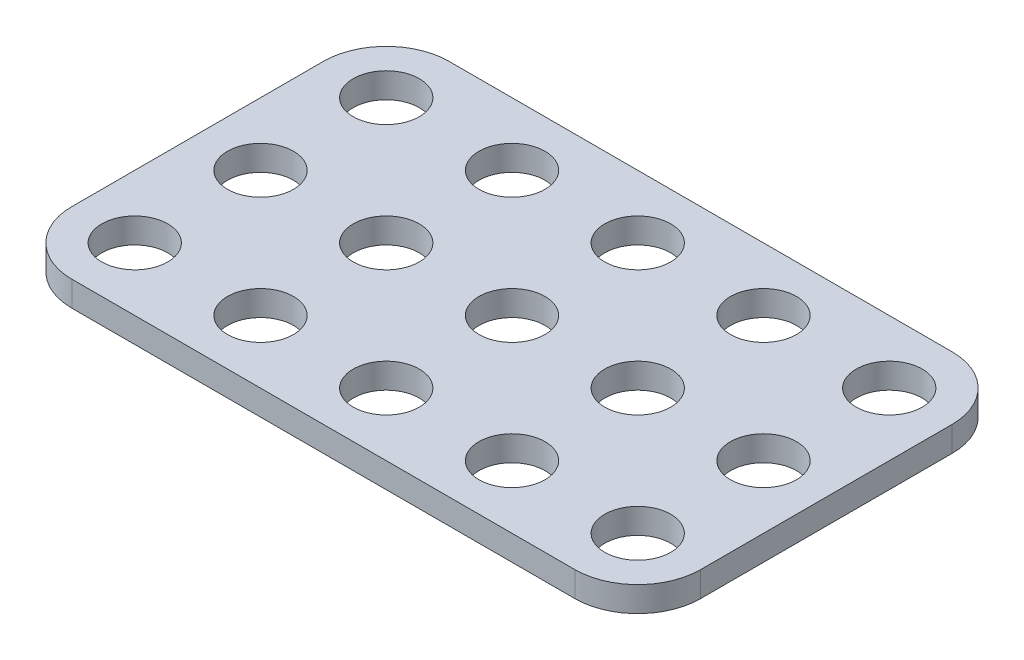
ISO-10303-21;
HEADER;
FILE_DESCRIPTION(('STEP AP214'),'2;1');
FILE_NAME('part.step','',(''),(''),'','','');
FILE_SCHEMA(('AUTOMOTIVE_DESIGN { 1 0 10303 214 1 1 1 1 }'));
ENDSEC;
DATA;
#1=APPLICATION_CONTEXT('core data for automotive mechanical design processes');
#2=APPLICATION_PROTOCOL_DEFINITION('international standard','automotive_design',2000,#1);
#3=PRODUCT_CONTEXT('',#1,'mechanical');
#4=PRODUCT('Part','Part','',(#3));
#5=PRODUCT_RELATED_PRODUCT_CATEGORY('part','',(#4));
#6=PRODUCT_DEFINITION_FORMATION('','',#4);
#7=PRODUCT_DEFINITION_CONTEXT('part definition',#1,'design');
#8=PRODUCT_DEFINITION('design','',#6,#7);
#9=PRODUCT_DEFINITION_SHAPE('','',#8);
#10=(LENGTH_UNIT() NAMED_UNIT(*) SI_UNIT(.MILLI.,.METRE.));
#11=(NAMED_UNIT(*) PLANE_ANGLE_UNIT() SI_UNIT($,.RADIAN.));
#12=(NAMED_UNIT(*) SI_UNIT($,.STERADIAN.) SOLID_ANGLE_UNIT());
#13=UNCERTAINTY_MEASURE_WITH_UNIT(LENGTH_MEASURE(1.E-05),#10,'distance_accuracy_value','');
#14=(GEOMETRIC_REPRESENTATION_CONTEXT(3) GLOBAL_UNCERTAINTY_ASSIGNED_CONTEXT((#13)) GLOBAL_UNIT_ASSIGNED_CONTEXT((#10,
#11,#12)) REPRESENTATION_CONTEXT('',''));
#15=CARTESIAN_POINT('',(0.,0.,0.));
#16=DIRECTION('',(0.,0.,1.));
#17=DIRECTION('',(1.,0.,0.));
#18=AXIS2_PLACEMENT_3D('',#15,#16,#17);
#19=CARTESIAN_POINT('',(0.,-1.6,-25.6));
#20=DIRECTION('',(0.,1.,0.));
#21=DIRECTION('',(0.,0.,1.));
#22=AXIS2_PLACEMENT_3D('',#19,#20,#21);
#23=PLANE('',#22);
#24=CARTESIAN_POINT('',(-4.8,-1.6,-20.8));
#25=DIRECTION('',(0.,1.,0.));
#26=DIRECTION('',(0.,0.,1.));
#27=AXIS2_PLACEMENT_3D('',#24,#25,#26);
#28=CIRCLE('',#27,2.09999999999999);
#29=CARTESIAN_POINT('',(-4.8,-1.6,-18.7));
#30=VERTEX_POINT('',#29);
#31=EDGE_CURVE('E170',#30,#30,#28,.T.);
#32=ORIENTED_EDGE('',*,*,#31,.T.);
#33=EDGE_LOOP('',(#32));
#34=FACE_BOUND('',#33,.T.);
#35=CARTESIAN_POINT('',(-12.8,-1.6,-20.8));
#36=DIRECTION('',(0.,1.,0.));
#37=DIRECTION('',(0.,0.,1.));
#38=AXIS2_PLACEMENT_3D('',#35,#36,#37);
#39=CIRCLE('',#38,2.09999999999999);
#40=CARTESIAN_POINT('',(-12.8,-1.6,-18.7));
#41=VERTEX_POINT('',#40);
#42=EDGE_CURVE('E173',#41,#41,#39,.T.);
#43=ORIENTED_EDGE('',*,*,#42,.T.);
#44=EDGE_LOOP('',(#43));
#45=FACE_BOUND('',#44,.T.);
#46=CARTESIAN_POINT('',(-20.8,-1.6,-20.8));
#47=DIRECTION('',(0.,1.,0.));
#48=DIRECTION('',(0.,0.,1.));
#49=AXIS2_PLACEMENT_3D('',#46,#47,#48);
#50=CIRCLE('',#49,2.09999999999999);
#51=CARTESIAN_POINT('',(-20.8,-1.6,-18.7));
#52=VERTEX_POINT('',#51);
#53=EDGE_CURVE('E176',#52,#52,#50,.T.);
#54=ORIENTED_EDGE('',*,*,#53,.T.);
#55=EDGE_LOOP('',(#54));
#56=FACE_BOUND('',#55,.T.);
#57=CARTESIAN_POINT('',(-28.8,-1.6,-20.8));
#58=DIRECTION('',(0.,1.,0.));
#59=DIRECTION('',(0.,0.,1.));
#60=AXIS2_PLACEMENT_3D('',#57,#58,#59);
#61=CIRCLE('',#60,2.09999999999999);
#62=CARTESIAN_POINT('',(-28.8,-1.6,-18.7));
#63=VERTEX_POINT('',#62);
#64=EDGE_CURVE('E179',#63,#63,#61,.T.);
#65=ORIENTED_EDGE('',*,*,#64,.T.);
#66=EDGE_LOOP('',(#65));
#67=FACE_BOUND('',#66,.T.);
#68=CARTESIAN_POINT('',(-36.8,-1.6,-20.8));
#69=DIRECTION('',(0.,1.,0.));
#70=DIRECTION('',(0.,0.,1.));
#71=AXIS2_PLACEMENT_3D('',#68,#69,#70);
#72=CIRCLE('',#71,2.09999999999999);
#73=CARTESIAN_POINT('',(-36.8,-1.6,-18.7));
#74=VERTEX_POINT('',#73);
#75=EDGE_CURVE('E182',#74,#74,#72,.T.);
#76=ORIENTED_EDGE('',*,*,#75,.T.);
#77=EDGE_LOOP('',(#76));
#78=FACE_BOUND('',#77,.T.);
#79=CARTESIAN_POINT('',(-4.8,-1.6,-12.8));
#80=DIRECTION('',(0.,1.,0.));
#81=DIRECTION('',(0.,0.,1.));
#82=AXIS2_PLACEMENT_3D('',#79,#80,#81);
#83=CIRCLE('',#82,2.09999999999999);
#84=CARTESIAN_POINT('',(-4.8,-1.6,-10.7));
#85=VERTEX_POINT('',#84);
#86=EDGE_CURVE('E185',#85,#85,#83,.T.);
#87=ORIENTED_EDGE('',*,*,#86,.T.);
#88=EDGE_LOOP('',(#87));
#89=FACE_BOUND('',#88,.T.);
#90=CARTESIAN_POINT('',(-12.8,-1.6,-12.8));
#91=DIRECTION('',(0.,1.,0.));
#92=DIRECTION('',(0.,0.,1.));
#93=AXIS2_PLACEMENT_3D('',#90,#91,#92);
#94=CIRCLE('',#93,2.09999999999999);
#95=CARTESIAN_POINT('',(-12.8,-1.6,-10.7));
#96=VERTEX_POINT('',#95);
#97=EDGE_CURVE('E188',#96,#96,#94,.T.);
#98=ORIENTED_EDGE('',*,*,#97,.T.);
#99=EDGE_LOOP('',(#98));
#100=FACE_BOUND('',#99,.T.);
#101=CARTESIAN_POINT('',(-20.8,-1.6,-12.8));
#102=DIRECTION('',(0.,1.,0.));
#103=DIRECTION('',(0.,0.,1.));
#104=AXIS2_PLACEMENT_3D('',#101,#102,#103);
#105=CIRCLE('',#104,2.09999999999999);
#106=CARTESIAN_POINT('',(-20.8,-1.6,-10.7));
#107=VERTEX_POINT('',#106);
#108=EDGE_CURVE('E191',#107,#107,#105,.T.);
#109=ORIENTED_EDGE('',*,*,#108,.T.);
#110=EDGE_LOOP('',(#109));
#111=FACE_BOUND('',#110,.T.);
#112=CARTESIAN_POINT('',(-28.8,-1.6,-12.8));
#113=DIRECTION('',(0.,1.,0.));
#114=DIRECTION('',(0.,0.,1.));
#115=AXIS2_PLACEMENT_3D('',#112,#113,#114);
#116=CIRCLE('',#115,2.09999999999999);
#117=CARTESIAN_POINT('',(-28.8,-1.6,-10.7));
#118=VERTEX_POINT('',#117);
#119=EDGE_CURVE('E194',#118,#118,#116,.T.);
#120=ORIENTED_EDGE('',*,*,#119,.T.);
#121=EDGE_LOOP('',(#120));
#122=FACE_BOUND('',#121,.T.);
#123=CARTESIAN_POINT('',(-36.8,-1.6,-12.8));
#124=DIRECTION('',(0.,1.,0.));
#125=DIRECTION('',(0.,0.,1.));
#126=AXIS2_PLACEMENT_3D('',#123,#124,#125);
#127=CIRCLE('',#126,2.09999999999999);
#128=CARTESIAN_POINT('',(-36.8,-1.6,-10.7));
#129=VERTEX_POINT('',#128);
#130=EDGE_CURVE('E197',#129,#129,#127,.T.);
#131=ORIENTED_EDGE('',*,*,#130,.T.);
#132=EDGE_LOOP('',(#131));
#133=FACE_BOUND('',#132,.T.);
#134=CARTESIAN_POINT('',(-4.8,-1.6,-4.8));
#135=DIRECTION('',(0.,1.,0.));
#136=DIRECTION('',(0.,0.,1.));
#137=AXIS2_PLACEMENT_3D('',#134,#135,#136);
#138=CIRCLE('',#137,2.09999999999999);
#139=CARTESIAN_POINT('',(-4.8,-1.6,-2.70000000000001));
#140=VERTEX_POINT('',#139);
#141=EDGE_CURVE('E200',#140,#140,#138,.T.);
#142=ORIENTED_EDGE('',*,*,#141,.T.);
#143=EDGE_LOOP('',(#142));
#144=FACE_BOUND('',#143,.T.);
#145=CARTESIAN_POINT('',(-12.8,-1.6,-4.8));
#146=DIRECTION('',(0.,1.,0.));
#147=DIRECTION('',(0.,0.,1.));
#148=AXIS2_PLACEMENT_3D('',#145,#146,#147);
#149=CIRCLE('',#148,2.09999999999999);
#150=CARTESIAN_POINT('',(-12.8,-1.6,-2.70000000000001));
#151=VERTEX_POINT('',#150);
#152=EDGE_CURVE('E203',#151,#151,#149,.T.);
#153=ORIENTED_EDGE('',*,*,#152,.T.);
#154=EDGE_LOOP('',(#153));
#155=FACE_BOUND('',#154,.T.);
#156=CARTESIAN_POINT('',(-20.8,-1.6,-4.8));
#157=DIRECTION('',(0.,1.,0.));
#158=DIRECTION('',(0.,0.,1.));
#159=AXIS2_PLACEMENT_3D('',#156,#157,#158);
#160=CIRCLE('',#159,2.09999999999999);
#161=CARTESIAN_POINT('',(-20.8,-1.6,-2.70000000000001));
#162=VERTEX_POINT('',#161);
#163=EDGE_CURVE('E206',#162,#162,#160,.T.);
#164=ORIENTED_EDGE('',*,*,#163,.T.);
#165=EDGE_LOOP('',(#164));
#166=FACE_BOUND('',#165,.T.);
#167=CARTESIAN_POINT('',(-36.8,-1.6,-4.79999999999999));
#168=DIRECTION('',(0.,1.,0.));
#169=DIRECTION('',(0.,0.,1.));
#170=AXIS2_PLACEMENT_3D('',#167,#168,#169);
#171=CIRCLE('',#170,2.09999999999999);
#172=CARTESIAN_POINT('',(-36.8,-1.6,-2.7));
#173=VERTEX_POINT('',#172);
#174=EDGE_CURVE('E209',#173,#173,#171,.T.);
#175=ORIENTED_EDGE('',*,*,#174,.T.);
#176=EDGE_LOOP('',(#175));
#177=FACE_BOUND('',#176,.T.);
#178=CARTESIAN_POINT('',(-28.8,-1.6,-4.8));
#179=DIRECTION('',(0.,1.,0.));
#180=DIRECTION('',(0.,0.,1.));
#181=AXIS2_PLACEMENT_3D('',#178,#179,#180);
#182=CIRCLE('',#181,2.09999999999999);
#183=CARTESIAN_POINT('',(-28.8,-1.6,-2.70000000000001));
#184=VERTEX_POINT('',#183);
#185=EDGE_CURVE('E212',#184,#184,#182,.T.);
#186=ORIENTED_EDGE('',*,*,#185,.T.);
#187=EDGE_LOOP('',(#186));
#188=FACE_BOUND('',#187,.T.);
#189=DIRECTION('',(1.,0.,0.));
#190=VECTOR('',#189,1.);
#191=CARTESIAN_POINT('',(-40.8,-1.6,-0.799999999999995));
#192=LINE('',#191,#190);
#193=CARTESIAN_POINT('',(-36.8,-1.6,-0.799999999999995));
#194=VERTEX_POINT('',#193);
#195=CARTESIAN_POINT('',(-4.80000000000001,-1.6,-0.799999999999995));
#196=VERTEX_POINT('',#195);
#197=EDGE_CURVE('E91',#194,#196,#192,.T.);
#198=ORIENTED_EDGE('',*,*,#197,.F.);
#199=CARTESIAN_POINT('',(-36.8,-1.6,-4.8));
#200=DIRECTION('',(0.,1.,0.));
#201=DIRECTION('',(0.,0.,1.));
#202=AXIS2_PLACEMENT_3D('',#199,#200,#201);
#203=CIRCLE('',#202,4.);
#204=CARTESIAN_POINT('',(-40.8,-1.6,-4.8));
#205=VERTEX_POINT('',#204);
#206=EDGE_CURVE('E19',#205,#194,#203,.T.);
#207=ORIENTED_EDGE('',*,*,#206,.F.);
#208=DIRECTION('',(0.,0.,1.));
#209=VECTOR('',#208,1.);
#210=CARTESIAN_POINT('',(-40.8,-1.6,-24.8));
#211=LINE('',#210,#209);
#212=CARTESIAN_POINT('',(-40.8,-1.6,-20.8));
#213=VERTEX_POINT('',#212);
#214=EDGE_CURVE('E77',#213,#205,#211,.T.);
#215=ORIENTED_EDGE('',*,*,#214,.F.);
#216=CARTESIAN_POINT('',(-36.8,-1.6,-20.8));
#217=DIRECTION('',(0.,1.,0.));
#218=DIRECTION('',(0.,0.,1.));
#219=AXIS2_PLACEMENT_3D('',#216,#217,#218);
#220=CIRCLE('',#219,4.);
#221=CARTESIAN_POINT('',(-36.8,-1.6,-24.8));
#222=VERTEX_POINT('',#221);
#223=EDGE_CURVE('E216',#222,#213,#220,.T.);
#224=ORIENTED_EDGE('',*,*,#223,.F.);
#225=DIRECTION('',(-1.,0.,0.));
#226=VECTOR('',#225,1.);
#227=CARTESIAN_POINT('',(-40.8,-1.6,-24.8));
#228=LINE('',#227,#226);
#229=CARTESIAN_POINT('',(-4.8,-1.6,-24.8));
#230=VERTEX_POINT('',#229);
#231=EDGE_CURVE('E108',#230,#222,#228,.T.);
#232=ORIENTED_EDGE('',*,*,#231,.F.);
#233=CARTESIAN_POINT('',(-4.8,-1.6,-20.8));
#234=DIRECTION('',(0.,1.,0.));
#235=DIRECTION('',(0.,0.,1.));
#236=AXIS2_PLACEMENT_3D('',#233,#234,#235);
#237=CIRCLE('',#236,4.);
#238=CARTESIAN_POINT('',(-0.800000000000002,-1.6,-20.8));
#239=VERTEX_POINT('',#238);
#240=EDGE_CURVE('E111',#239,#230,#237,.T.);
#241=ORIENTED_EDGE('',*,*,#240,.F.);
#242=DIRECTION('',(0.,0.,-1.));
#243=VECTOR('',#242,1.);
#244=CARTESIAN_POINT('',(-0.800000000000002,-1.6,-24.8));
#245=LINE('',#244,#243);
#246=CARTESIAN_POINT('',(-0.800000000000002,-1.6,-4.8));
#247=VERTEX_POINT('',#246);
#248=EDGE_CURVE('E112',#247,#239,#245,.T.);
#249=ORIENTED_EDGE('',*,*,#248,.F.);
#250=CARTESIAN_POINT('',(-4.80000000000001,-1.6,-4.8));
#251=DIRECTION('',(0.,1.,0.));
#252=DIRECTION('',(0.,0.,1.));
#253=AXIS2_PLACEMENT_3D('',#250,#251,#252);
#254=CIRCLE('',#253,4.);
#255=EDGE_CURVE('E93',#196,#247,#254,.T.);
#256=ORIENTED_EDGE('',*,*,#255,.F.);
#257=EDGE_LOOP('',(#198,#207,#215,#224,#232,#241,#249,#256));
#258=FACE_BOUND('',#257,.T.);
#259=ADVANCED_FACE('F16',(#34,#45,#56,#67,#78,#89,#100,#111,#122,#133,#144,#155,#166,#177,#188,
#258),#23,.F.);
#260=CARTESIAN_POINT('',(-40.8,-10.,-24.8));
#261=DIRECTION('',(-1.,0.,0.));
#262=DIRECTION('',(0.,0.,1.));
#263=AXIS2_PLACEMENT_3D('',#260,#261,#262);
#264=PLANE('',#263);
#265=DIRECTION('',(0.,0.,1.));
#266=VECTOR('',#265,1.);
#267=CARTESIAN_POINT('',(-40.8,0.,-25.6));
#268=LINE('',#267,#266);
#269=CARTESIAN_POINT('',(-40.8,0.,-20.8));
#270=VERTEX_POINT('',#269);
#271=CARTESIAN_POINT('',(-40.8,0.,-4.8));
#272=VERTEX_POINT('',#271);
#273=EDGE_CURVE('E169',#270,#272,#268,.T.);
#274=ORIENTED_EDGE('',*,*,#273,.F.);
#275=DIRECTION('',(0.,1.,0.));
#276=VECTOR('',#275,1.);
#277=CARTESIAN_POINT('',(-40.8,-10.,-20.8));
#278=LINE('',#277,#276);
#279=EDGE_CURVE('E215',#213,#270,#278,.T.);
#280=ORIENTED_EDGE('',*,*,#279,.F.);
#281=ORIENTED_EDGE('',*,*,#214,.T.);
#282=DIRECTION('',(0.,1.,0.));
#283=VECTOR('',#282,1.);
#284=CARTESIAN_POINT('',(-40.8,-10.,-4.8));
#285=LINE('',#284,#283);
#286=EDGE_CURVE('E88',#272,#205,#285,.F.);
#287=ORIENTED_EDGE('',*,*,#286,.F.);
#288=EDGE_LOOP('',(#274,#280,#281,#287));
#289=FACE_BOUND('',#288,.T.);
#290=ADVANCED_FACE('F334',(#289),#264,.T.);
#291=CARTESIAN_POINT('',(-36.8,-10.,-4.8));
#292=DIRECTION('',(0.,1.,0.));
#293=DIRECTION('',(0.,0.,1.));
#294=AXIS2_PLACEMENT_3D('',#291,#292,#293);
#295=CYLINDRICAL_SURFACE('',#294,4.);
#296=ORIENTED_EDGE('',*,*,#206,.T.);
#297=DIRECTION('',(0.,1.,0.));
#298=VECTOR('',#297,1.);
#299=CARTESIAN_POINT('',(-36.8,-10.,-0.799999999999995));
#300=LINE('',#299,#298);
#301=CARTESIAN_POINT('',(-36.8,0.,-0.799999999999995));
#302=VERTEX_POINT('',#301);
#303=EDGE_CURVE('E86',#302,#194,#300,.F.);
#304=ORIENTED_EDGE('',*,*,#303,.F.);
#305=CARTESIAN_POINT('',(-36.8,0.,-4.8));
#306=DIRECTION('',(0.,1.,0.));
#307=DIRECTION('',(0.,0.,1.));
#308=AXIS2_PLACEMENT_3D('',#305,#306,#307);
#309=CIRCLE('',#308,4.);
#310=EDGE_CURVE('E167',#272,#302,#309,.T.);
#311=ORIENTED_EDGE('',*,*,#310,.F.);
#312=ORIENTED_EDGE('',*,*,#286,.T.);
#313=EDGE_LOOP('',(#296,#304,#311,#312));
#314=FACE_BOUND('',#313,.T.);
#315=ADVANCED_FACE('F83',(#314),#295,.T.);
#316=CARTESIAN_POINT('',(-40.8,-10.,-0.799999999999995));
#317=DIRECTION('',(0.,0.,1.));
#318=DIRECTION('',(1.,0.,0.));
#319=AXIS2_PLACEMENT_3D('',#316,#317,#318);
#320=PLANE('',#319);
#321=ORIENTED_EDGE('',*,*,#197,.T.);
#322=DIRECTION('',(0.,1.,0.));
#323=VECTOR('',#322,1.);
#324=CARTESIAN_POINT('',(-4.80000000000001,-10.,-0.799999999999995));
#325=LINE('',#324,#323);
#326=CARTESIAN_POINT('',(-4.80000000000001,0.,-0.799999999999995));
#327=VERTEX_POINT('',#326);
#328=EDGE_CURVE('E96',#327,#196,#325,.F.);
#329=ORIENTED_EDGE('',*,*,#328,.F.);
#330=DIRECTION('',(1.,0.,0.));
#331=VECTOR('',#330,1.);
#332=CARTESIAN_POINT('',(0.,0.,-0.799999999999995));
#333=LINE('',#332,#331);
#334=EDGE_CURVE('E100',#302,#327,#333,.T.);
#335=ORIENTED_EDGE('',*,*,#334,.F.);
#336=ORIENTED_EDGE('',*,*,#303,.T.);
#337=EDGE_LOOP('',(#321,#329,#335,#336));
#338=FACE_BOUND('',#337,.T.);
#339=ADVANCED_FACE('F98',(#338),#320,.T.);
#340=CARTESIAN_POINT('',(-4.80000000000001,-10.,-4.8));
#341=DIRECTION('',(0.,1.,0.));
#342=DIRECTION('',(0.,0.,1.));
#343=AXIS2_PLACEMENT_3D('',#340,#341,#342);
#344=CYLINDRICAL_SURFACE('',#343,4.);
#345=ORIENTED_EDGE('',*,*,#255,.T.);
#346=DIRECTION('',(0.,1.,0.));
#347=VECTOR('',#346,1.);
#348=CARTESIAN_POINT('',(-0.800000000000002,-10.,-4.8));
#349=LINE('',#348,#347);
#350=CARTESIAN_POINT('',(-0.800000000000002,0.,-4.8));
#351=VERTEX_POINT('',#350);
#352=EDGE_CURVE('E113',#351,#247,#349,.F.);
#353=ORIENTED_EDGE('',*,*,#352,.F.);
#354=CARTESIAN_POINT('',(-4.80000000000001,0.,-4.8));
#355=DIRECTION('',(0.,1.,0.));
#356=DIRECTION('',(0.,0.,1.));
#357=AXIS2_PLACEMENT_3D('',#354,#355,#356);
#358=CIRCLE('',#357,4.);
#359=EDGE_CURVE('E164',#327,#351,#358,.T.);
#360=ORIENTED_EDGE('',*,*,#359,.F.);
#361=ORIENTED_EDGE('',*,*,#328,.T.);
#362=EDGE_LOOP('',(#345,#353,#360,#361));
#363=FACE_BOUND('',#362,.T.);
#364=ADVANCED_FACE('F224',(#363),#344,.T.);
#365=CARTESIAN_POINT('',(-0.800000000000002,-10.,-24.8));
#366=DIRECTION('',(1.,0.,0.));
#367=DIRECTION('',(0.,0.,-1.));
#368=AXIS2_PLACEMENT_3D('',#365,#366,#367);
#369=PLANE('',#368);
#370=DIRECTION('',(0.,0.,1.));
#371=VECTOR('',#370,1.);
#372=CARTESIAN_POINT('',(-0.800000000000002,0.,-25.6));
#373=LINE('',#372,#371);
#374=CARTESIAN_POINT('',(-0.800000000000002,0.,-20.8));
#375=VERTEX_POINT('',#374);
#376=EDGE_CURVE('E163',#351,#375,#373,.F.);
#377=ORIENTED_EDGE('',*,*,#376,.F.);
#378=ORIENTED_EDGE('',*,*,#352,.T.);
#379=ORIENTED_EDGE('',*,*,#248,.T.);
#380=DIRECTION('',(0.,1.,0.));
#381=VECTOR('',#380,1.);
#382=CARTESIAN_POINT('',(-0.800000000000002,-10.,-20.8));
#383=LINE('',#382,#381);
#384=EDGE_CURVE('E220',#375,#239,#383,.F.);
#385=ORIENTED_EDGE('',*,*,#384,.F.);
#386=EDGE_LOOP('',(#377,#378,#379,#385));
#387=FACE_BOUND('',#386,.T.);
#388=ADVANCED_FACE('F243',(#387),#369,.T.);
#389=CARTESIAN_POINT('',(-4.8,-10.,-20.8));
#390=DIRECTION('',(0.,1.,0.));
#391=DIRECTION('',(0.,0.,1.));
#392=AXIS2_PLACEMENT_3D('',#389,#390,#391);
#393=CYLINDRICAL_SURFACE('',#392,4.);
#394=ORIENTED_EDGE('',*,*,#240,.T.);
#395=DIRECTION('',(0.,1.,0.));
#396=VECTOR('',#395,1.);
#397=CARTESIAN_POINT('',(-4.80000000000001,-10.,-24.8));
#398=LINE('',#397,#396);
#399=CARTESIAN_POINT('',(-4.8,0.,-24.8));
#400=VERTEX_POINT('',#399);
#401=EDGE_CURVE('E110',#400,#230,#398,.F.);
#402=ORIENTED_EDGE('',*,*,#401,.F.);
#403=CARTESIAN_POINT('',(-4.8,0.,-20.8));
#404=DIRECTION('',(0.,1.,0.));
#405=DIRECTION('',(0.,0.,1.));
#406=AXIS2_PLACEMENT_3D('',#403,#404,#405);
#407=CIRCLE('',#406,4.);
#408=EDGE_CURVE('E160',#375,#400,#407,.T.);
#409=ORIENTED_EDGE('',*,*,#408,.F.);
#410=ORIENTED_EDGE('',*,*,#384,.T.);
#411=EDGE_LOOP('',(#394,#402,#409,#410));
#412=FACE_BOUND('',#411,.T.);
#413=ADVANCED_FACE('F247',(#412),#393,.T.);
#414=CARTESIAN_POINT('',(-40.8,-10.,-24.8));
#415=DIRECTION('',(0.,0.,-1.));
#416=DIRECTION('',(-1.,0.,0.));
#417=AXIS2_PLACEMENT_3D('',#414,#415,#416);
#418=PLANE('',#417);
#419=DIRECTION('',(1.,0.,0.));
#420=VECTOR('',#419,1.);
#421=CARTESIAN_POINT('',(0.,0.,-24.8));
#422=LINE('',#421,#420);
#423=CARTESIAN_POINT('',(-36.8,0.,-24.8));
#424=VERTEX_POINT('',#423);
#425=EDGE_CURVE('E159',#400,#424,#422,.F.);
#426=ORIENTED_EDGE('',*,*,#425,.F.);
#427=ORIENTED_EDGE('',*,*,#401,.T.);
#428=ORIENTED_EDGE('',*,*,#231,.T.);
#429=DIRECTION('',(0.,1.,0.));
#430=VECTOR('',#429,1.);
#431=CARTESIAN_POINT('',(-36.8,-10.,-24.8));
#432=LINE('',#431,#430);
#433=EDGE_CURVE('E34',#424,#222,#432,.F.);
#434=ORIENTED_EDGE('',*,*,#433,.F.);
#435=EDGE_LOOP('',(#426,#427,#428,#434));
#436=FACE_BOUND('',#435,.T.);
#437=ADVANCED_FACE('F248',(#436),#418,.T.);
#438=CARTESIAN_POINT('',(-36.8,-10.,-20.8));
#439=DIRECTION('',(0.,1.,0.));
#440=DIRECTION('',(0.,0.,1.));
#441=AXIS2_PLACEMENT_3D('',#438,#439,#440);
#442=CYLINDRICAL_SURFACE('',#441,4.);
#443=ORIENTED_EDGE('',*,*,#223,.T.);
#444=ORIENTED_EDGE('',*,*,#279,.T.);
#445=CARTESIAN_POINT('',(-36.8,0.,-20.8));
#446=DIRECTION('',(0.,1.,0.));
#447=DIRECTION('',(0.,0.,1.));
#448=AXIS2_PLACEMENT_3D('',#445,#446,#447);
#449=CIRCLE('',#448,4.);
#450=EDGE_CURVE('E156',#424,#270,#449,.T.);
#451=ORIENTED_EDGE('',*,*,#450,.F.);
#452=ORIENTED_EDGE('',*,*,#433,.T.);
#453=EDGE_LOOP('',(#443,#444,#451,#452));
#454=FACE_BOUND('',#453,.T.);
#455=ADVANCED_FACE('F250',(#454),#442,.T.);
#456=CARTESIAN_POINT('',(-28.8,-10.,-4.8));
#457=DIRECTION('',(0.,1.,0.));
#458=DIRECTION('',(0.,0.,1.));
#459=AXIS2_PLACEMENT_3D('',#456,#457,#458);
#460=CYLINDRICAL_SURFACE('',#459,2.09999999999999);
#461=ORIENTED_EDGE('',*,*,#185,.F.);
#462=EDGE_LOOP('',(#461));
#463=FACE_BOUND('',#462,.T.);
#464=CARTESIAN_POINT('',(-28.8,0.,-4.8));
#465=DIRECTION('',(0.,1.,0.));
#466=DIRECTION('',(0.,0.,1.));
#467=AXIS2_PLACEMENT_3D('',#464,#465,#466);
#468=CIRCLE('',#467,2.09999999999999);
#469=CARTESIAN_POINT('',(-28.8,0.,-2.70000000000001));
#470=VERTEX_POINT('',#469);
#471=EDGE_CURVE('E153',#470,#470,#468,.F.);
#472=ORIENTED_EDGE('',*,*,#471,.F.);
#473=EDGE_LOOP('',(#472));
#474=FACE_BOUND('',#473,.T.);
#475=ADVANCED_FACE('F257',(#463,#474),#460,.F.);
#476=CARTESIAN_POINT('',(-36.8,-10.,-4.79999999999999));
#477=DIRECTION('',(0.,1.,0.));
#478=DIRECTION('',(0.,0.,1.));
#479=AXIS2_PLACEMENT_3D('',#476,#477,#478);
#480=CYLINDRICAL_SURFACE('',#479,2.09999999999999);
#481=ORIENTED_EDGE('',*,*,#174,.F.);
#482=EDGE_LOOP('',(#481));
#483=FACE_BOUND('',#482,.T.);
#484=CARTESIAN_POINT('',(-36.8,0.,-4.79999999999999));
#485=DIRECTION('',(0.,1.,0.));
#486=DIRECTION('',(0.,0.,1.));
#487=AXIS2_PLACEMENT_3D('',#484,#485,#486);
#488=CIRCLE('',#487,2.09999999999999);
#489=CARTESIAN_POINT('',(-36.8,0.,-2.7));
#490=VERTEX_POINT('',#489);
#491=EDGE_CURVE('E150',#490,#490,#488,.F.);
#492=ORIENTED_EDGE('',*,*,#491,.F.);
#493=EDGE_LOOP('',(#492));
#494=FACE_BOUND('',#493,.T.);
#495=ADVANCED_FACE('F319',(#483,#494),#480,.F.);
#496=CARTESIAN_POINT('',(-20.8,-10.,-4.8));
#497=DIRECTION('',(0.,1.,0.));
#498=DIRECTION('',(0.,0.,1.));
#499=AXIS2_PLACEMENT_3D('',#496,#497,#498);
#500=CYLINDRICAL_SURFACE('',#499,2.09999999999999);
#501=ORIENTED_EDGE('',*,*,#163,.F.);
#502=EDGE_LOOP('',(#501));
#503=FACE_BOUND('',#502,.T.);
#504=CARTESIAN_POINT('',(-20.8,0.,-4.8));
#505=DIRECTION('',(0.,1.,0.));
#506=DIRECTION('',(0.,0.,1.));
#507=AXIS2_PLACEMENT_3D('',#504,#505,#506);
#508=CIRCLE('',#507,2.09999999999999);
#509=CARTESIAN_POINT('',(-20.8,0.,-2.70000000000001));
#510=VERTEX_POINT('',#509);
#511=EDGE_CURVE('E147',#510,#510,#508,.F.);
#512=ORIENTED_EDGE('',*,*,#511,.F.);
#513=EDGE_LOOP('',(#512));
#514=FACE_BOUND('',#513,.T.);
#515=ADVANCED_FACE('F315',(#503,#514),#500,.F.);
#516=CARTESIAN_POINT('',(-12.8,-10.,-4.8));
#517=DIRECTION('',(0.,1.,0.));
#518=DIRECTION('',(0.,0.,1.));
#519=AXIS2_PLACEMENT_3D('',#516,#517,#518);
#520=CYLINDRICAL_SURFACE('',#519,2.09999999999999);
#521=ORIENTED_EDGE('',*,*,#152,.F.);
#522=EDGE_LOOP('',(#521));
#523=FACE_BOUND('',#522,.T.);
#524=CARTESIAN_POINT('',(-12.8,0.,-4.8));
#525=DIRECTION('',(0.,1.,0.));
#526=DIRECTION('',(0.,0.,1.));
#527=AXIS2_PLACEMENT_3D('',#524,#525,#526);
#528=CIRCLE('',#527,2.09999999999999);
#529=CARTESIAN_POINT('',(-12.8,0.,-2.70000000000001));
#530=VERTEX_POINT('',#529);
#531=EDGE_CURVE('E144',#530,#530,#528,.F.);
#532=ORIENTED_EDGE('',*,*,#531,.F.);
#533=EDGE_LOOP('',(#532));
#534=FACE_BOUND('',#533,.T.);
#535=ADVANCED_FACE('F311',(#523,#534),#520,.F.);
#536=CARTESIAN_POINT('',(-4.8,-10.,-4.8));
#537=DIRECTION('',(0.,1.,0.));
#538=DIRECTION('',(0.,0.,1.));
#539=AXIS2_PLACEMENT_3D('',#536,#537,#538);
#540=CYLINDRICAL_SURFACE('',#539,2.09999999999999);
#541=ORIENTED_EDGE('',*,*,#141,.F.);
#542=EDGE_LOOP('',(#541));
#543=FACE_BOUND('',#542,.T.);
#544=CARTESIAN_POINT('',(-4.8,0.,-4.8));
#545=DIRECTION('',(0.,1.,0.));
#546=DIRECTION('',(0.,0.,1.));
#547=AXIS2_PLACEMENT_3D('',#544,#545,#546);
#548=CIRCLE('',#547,2.09999999999999);
#549=CARTESIAN_POINT('',(-4.8,0.,-2.70000000000001));
#550=VERTEX_POINT('',#549);
#551=EDGE_CURVE('E141',#550,#550,#548,.F.);
#552=ORIENTED_EDGE('',*,*,#551,.F.);
#553=EDGE_LOOP('',(#552));
#554=FACE_BOUND('',#553,.T.);
#555=ADVANCED_FACE('F307',(#543,#554),#540,.F.);
#556=CARTESIAN_POINT('',(-36.8,-10.,-12.8));
#557=DIRECTION('',(0.,1.,0.));
#558=DIRECTION('',(0.,0.,1.));
#559=AXIS2_PLACEMENT_3D('',#556,#557,#558);
#560=CYLINDRICAL_SURFACE('',#559,2.09999999999999);
#561=ORIENTED_EDGE('',*,*,#130,.F.);
#562=EDGE_LOOP('',(#561));
#563=FACE_BOUND('',#562,.T.);
#564=CARTESIAN_POINT('',(-36.8,0.,-12.8));
#565=DIRECTION('',(0.,1.,0.));
#566=DIRECTION('',(0.,0.,1.));
#567=AXIS2_PLACEMENT_3D('',#564,#565,#566);
#568=CIRCLE('',#567,2.09999999999999);
#569=CARTESIAN_POINT('',(-36.8,0.,-10.7));
#570=VERTEX_POINT('',#569);
#571=EDGE_CURVE('E138',#570,#570,#568,.F.);
#572=ORIENTED_EDGE('',*,*,#571,.F.);
#573=EDGE_LOOP('',(#572));
#574=FACE_BOUND('',#573,.T.);
#575=ADVANCED_FACE('F303',(#563,#574),#560,.F.);
#576=CARTESIAN_POINT('',(-28.8,-10.,-12.8));
#577=DIRECTION('',(0.,1.,0.));
#578=DIRECTION('',(0.,0.,1.));
#579=AXIS2_PLACEMENT_3D('',#576,#577,#578);
#580=CYLINDRICAL_SURFACE('',#579,2.09999999999999);
#581=ORIENTED_EDGE('',*,*,#119,.F.);
#582=EDGE_LOOP('',(#581));
#583=FACE_BOUND('',#582,.T.);
#584=CARTESIAN_POINT('',(-28.8,0.,-12.8));
#585=DIRECTION('',(0.,1.,0.));
#586=DIRECTION('',(0.,0.,1.));
#587=AXIS2_PLACEMENT_3D('',#584,#585,#586);
#588=CIRCLE('',#587,2.09999999999999);
#589=CARTESIAN_POINT('',(-28.8,0.,-10.7));
#590=VERTEX_POINT('',#589);
#591=EDGE_CURVE('E135',#590,#590,#588,.F.);
#592=ORIENTED_EDGE('',*,*,#591,.F.);
#593=EDGE_LOOP('',(#592));
#594=FACE_BOUND('',#593,.T.);
#595=ADVANCED_FACE('F299',(#583,#594),#580,.F.);
#596=CARTESIAN_POINT('',(-20.8,-10.,-12.8));
#597=DIRECTION('',(0.,1.,0.));
#598=DIRECTION('',(0.,0.,1.));
#599=AXIS2_PLACEMENT_3D('',#596,#597,#598);
#600=CYLINDRICAL_SURFACE('',#599,2.09999999999999);
#601=ORIENTED_EDGE('',*,*,#108,.F.);
#602=EDGE_LOOP('',(#601));
#603=FACE_BOUND('',#602,.T.);
#604=CARTESIAN_POINT('',(-20.8,0.,-12.8));
#605=DIRECTION('',(0.,1.,0.));
#606=DIRECTION('',(0.,0.,1.));
#607=AXIS2_PLACEMENT_3D('',#604,#605,#606);
#608=CIRCLE('',#607,2.09999999999999);
#609=CARTESIAN_POINT('',(-20.8,0.,-10.7));
#610=VERTEX_POINT('',#609);
#611=EDGE_CURVE('E132',#610,#610,#608,.F.);
#612=ORIENTED_EDGE('',*,*,#611,.F.);
#613=EDGE_LOOP('',(#612));
#614=FACE_BOUND('',#613,.T.);
#615=ADVANCED_FACE('F295',(#603,#614),#600,.F.);
#616=CARTESIAN_POINT('',(-12.8,-10.,-12.8));
#617=DIRECTION('',(0.,1.,0.));
#618=DIRECTION('',(0.,0.,1.));
#619=AXIS2_PLACEMENT_3D('',#616,#617,#618);
#620=CYLINDRICAL_SURFACE('',#619,2.09999999999999);
#621=ORIENTED_EDGE('',*,*,#97,.F.);
#622=EDGE_LOOP('',(#621));
#623=FACE_BOUND('',#622,.T.);
#624=CARTESIAN_POINT('',(-12.8,0.,-12.8));
#625=DIRECTION('',(0.,1.,0.));
#626=DIRECTION('',(0.,0.,1.));
#627=AXIS2_PLACEMENT_3D('',#624,#625,#626);
#628=CIRCLE('',#627,2.09999999999999);
#629=CARTESIAN_POINT('',(-12.8,0.,-10.7));
#630=VERTEX_POINT('',#629);
#631=EDGE_CURVE('E129',#630,#630,#628,.F.);
#632=ORIENTED_EDGE('',*,*,#631,.F.);
#633=EDGE_LOOP('',(#632));
#634=FACE_BOUND('',#633,.T.);
#635=ADVANCED_FACE('F291',(#623,#634),#620,.F.);
#636=CARTESIAN_POINT('',(-4.8,-10.,-12.8));
#637=DIRECTION('',(0.,1.,0.));
#638=DIRECTION('',(0.,0.,1.));
#639=AXIS2_PLACEMENT_3D('',#636,#637,#638);
#640=CYLINDRICAL_SURFACE('',#639,2.09999999999999);
#641=ORIENTED_EDGE('',*,*,#86,.F.);
#642=EDGE_LOOP('',(#641));
#643=FACE_BOUND('',#642,.T.);
#644=CARTESIAN_POINT('',(-4.8,0.,-12.8));
#645=DIRECTION('',(0.,1.,0.));
#646=DIRECTION('',(0.,0.,1.));
#647=AXIS2_PLACEMENT_3D('',#644,#645,#646);
#648=CIRCLE('',#647,2.09999999999999);
#649=CARTESIAN_POINT('',(-4.8,0.,-10.7));
#650=VERTEX_POINT('',#649);
#651=EDGE_CURVE('E126',#650,#650,#648,.F.);
#652=ORIENTED_EDGE('',*,*,#651,.F.);
#653=EDGE_LOOP('',(#652));
#654=FACE_BOUND('',#653,.T.);
#655=ADVANCED_FACE('F287',(#643,#654),#640,.F.);
#656=CARTESIAN_POINT('',(-36.8,-10.,-20.8));
#657=DIRECTION('',(0.,1.,0.));
#658=DIRECTION('',(0.,0.,1.));
#659=AXIS2_PLACEMENT_3D('',#656,#657,#658);
#660=CYLINDRICAL_SURFACE('',#659,2.09999999999999);
#661=ORIENTED_EDGE('',*,*,#75,.F.);
#662=EDGE_LOOP('',(#661));
#663=FACE_BOUND('',#662,.T.);
#664=CARTESIAN_POINT('',(-36.8,0.,-20.8));
#665=DIRECTION('',(0.,1.,0.));
#666=DIRECTION('',(0.,0.,1.));
#667=AXIS2_PLACEMENT_3D('',#664,#665,#666);
#668=CIRCLE('',#667,2.09999999999999);
#669=CARTESIAN_POINT('',(-36.8,0.,-18.7));
#670=VERTEX_POINT('',#669);
#671=EDGE_CURVE('E123',#670,#670,#668,.F.);
#672=ORIENTED_EDGE('',*,*,#671,.F.);
#673=EDGE_LOOP('',(#672));
#674=FACE_BOUND('',#673,.T.);
#675=ADVANCED_FACE('F283',(#663,#674),#660,.F.);
#676=CARTESIAN_POINT('',(-28.8,-10.,-20.8));
#677=DIRECTION('',(0.,1.,0.));
#678=DIRECTION('',(0.,0.,1.));
#679=AXIS2_PLACEMENT_3D('',#676,#677,#678);
#680=CYLINDRICAL_SURFACE('',#679,2.09999999999999);
#681=ORIENTED_EDGE('',*,*,#64,.F.);
#682=EDGE_LOOP('',(#681));
#683=FACE_BOUND('',#682,.T.);
#684=CARTESIAN_POINT('',(-28.8,0.,-20.8));
#685=DIRECTION('',(0.,1.,0.));
#686=DIRECTION('',(0.,0.,1.));
#687=AXIS2_PLACEMENT_3D('',#684,#685,#686);
#688=CIRCLE('',#687,2.09999999999999);
#689=CARTESIAN_POINT('',(-28.8,0.,-18.7));
#690=VERTEX_POINT('',#689);
#691=EDGE_CURVE('E120',#690,#690,#688,.F.);
#692=ORIENTED_EDGE('',*,*,#691,.F.);
#693=EDGE_LOOP('',(#692));
#694=FACE_BOUND('',#693,.T.);
#695=ADVANCED_FACE('F279',(#683,#694),#680,.F.);
#696=CARTESIAN_POINT('',(-20.8,-10.,-20.8));
#697=DIRECTION('',(0.,1.,0.));
#698=DIRECTION('',(0.,0.,1.));
#699=AXIS2_PLACEMENT_3D('',#696,#697,#698);
#700=CYLINDRICAL_SURFACE('',#699,2.09999999999999);
#701=ORIENTED_EDGE('',*,*,#53,.F.);
#702=EDGE_LOOP('',(#701));
#703=FACE_BOUND('',#702,.T.);
#704=CARTESIAN_POINT('',(-20.8,0.,-20.8));
#705=DIRECTION('',(0.,1.,0.));
#706=DIRECTION('',(0.,0.,1.));
#707=AXIS2_PLACEMENT_3D('',#704,#705,#706);
#708=CIRCLE('',#707,2.09999999999999);
#709=CARTESIAN_POINT('',(-20.8,0.,-18.7));
#710=VERTEX_POINT('',#709);
#711=EDGE_CURVE('E117',#710,#710,#708,.F.);
#712=ORIENTED_EDGE('',*,*,#711,.F.);
#713=EDGE_LOOP('',(#712));
#714=FACE_BOUND('',#713,.T.);
#715=ADVANCED_FACE('F275',(#703,#714),#700,.F.);
#716=CARTESIAN_POINT('',(-12.8,-10.,-20.8));
#717=DIRECTION('',(0.,1.,0.));
#718=DIRECTION('',(0.,0.,1.));
#719=AXIS2_PLACEMENT_3D('',#716,#717,#718);
#720=CYLINDRICAL_SURFACE('',#719,2.09999999999999);
#721=ORIENTED_EDGE('',*,*,#42,.F.);
#722=EDGE_LOOP('',(#721));
#723=FACE_BOUND('',#722,.T.);
#724=CARTESIAN_POINT('',(-12.8,0.,-20.8));
#725=DIRECTION('',(0.,1.,0.));
#726=DIRECTION('',(0.,0.,1.));
#727=AXIS2_PLACEMENT_3D('',#724,#725,#726);
#728=CIRCLE('',#727,2.09999999999999);
#729=CARTESIAN_POINT('',(-12.8,0.,-18.7));
#730=VERTEX_POINT('',#729);
#731=EDGE_CURVE('E25',#730,#730,#728,.F.);
#732=ORIENTED_EDGE('',*,*,#731,.F.);
#733=EDGE_LOOP('',(#732));
#734=FACE_BOUND('',#733,.T.);
#735=ADVANCED_FACE('F268',(#723,#734),#720,.F.);
#736=CARTESIAN_POINT('',(-4.8,-10.,-20.8));
#737=DIRECTION('',(0.,1.,0.));
#738=DIRECTION('',(0.,0.,1.));
#739=AXIS2_PLACEMENT_3D('',#736,#737,#738);
#740=CYLINDRICAL_SURFACE('',#739,2.09999999999999);
#741=ORIENTED_EDGE('',*,*,#31,.F.);
#742=EDGE_LOOP('',(#741));
#743=FACE_BOUND('',#742,.T.);
#744=CARTESIAN_POINT('',(-4.8,0.,-20.8));
#745=DIRECTION('',(0.,1.,0.));
#746=DIRECTION('',(0.,0.,1.));
#747=AXIS2_PLACEMENT_3D('',#744,#745,#746);
#748=CIRCLE('',#747,2.09999999999999);
#749=CARTESIAN_POINT('',(-4.8,0.,-18.7));
#750=VERTEX_POINT('',#749);
#751=EDGE_CURVE('E11',#750,#750,#748,.F.);
#752=ORIENTED_EDGE('',*,*,#751,.F.);
#753=EDGE_LOOP('',(#752));
#754=FACE_BOUND('',#753,.T.);
#755=ADVANCED_FACE('F262',(#743,#754),#740,.F.);
#756=CARTESIAN_POINT('',(0.,0.,-25.6));
#757=DIRECTION('',(0.,1.,0.));
#758=DIRECTION('',(0.,0.,1.));
#759=AXIS2_PLACEMENT_3D('',#756,#757,#758);
#760=PLANE('',#759);
#761=ORIENTED_EDGE('',*,*,#751,.T.);
#762=EDGE_LOOP('',(#761));
#763=FACE_BOUND('',#762,.T.);
#764=ORIENTED_EDGE('',*,*,#731,.T.);
#765=EDGE_LOOP('',(#764));
#766=FACE_BOUND('',#765,.T.);
#767=ORIENTED_EDGE('',*,*,#711,.T.);
#768=EDGE_LOOP('',(#767));
#769=FACE_BOUND('',#768,.T.);
#770=ORIENTED_EDGE('',*,*,#691,.T.);
#771=EDGE_LOOP('',(#770));
#772=FACE_BOUND('',#771,.T.);
#773=ORIENTED_EDGE('',*,*,#671,.T.);
#774=EDGE_LOOP('',(#773));
#775=FACE_BOUND('',#774,.T.);
#776=ORIENTED_EDGE('',*,*,#651,.T.);
#777=EDGE_LOOP('',(#776));
#778=FACE_BOUND('',#777,.T.);
#779=ORIENTED_EDGE('',*,*,#631,.T.);
#780=EDGE_LOOP('',(#779));
#781=FACE_BOUND('',#780,.T.);
#782=ORIENTED_EDGE('',*,*,#611,.T.);
#783=EDGE_LOOP('',(#782));
#784=FACE_BOUND('',#783,.T.);
#785=ORIENTED_EDGE('',*,*,#591,.T.);
#786=EDGE_LOOP('',(#785));
#787=FACE_BOUND('',#786,.T.);
#788=ORIENTED_EDGE('',*,*,#571,.T.);
#789=EDGE_LOOP('',(#788));
#790=FACE_BOUND('',#789,.T.);
#791=ORIENTED_EDGE('',*,*,#551,.T.);
#792=EDGE_LOOP('',(#791));
#793=FACE_BOUND('',#792,.T.);
#794=ORIENTED_EDGE('',*,*,#531,.T.);
#795=EDGE_LOOP('',(#794));
#796=FACE_BOUND('',#795,.T.);
#797=ORIENTED_EDGE('',*,*,#511,.T.);
#798=EDGE_LOOP('',(#797));
#799=FACE_BOUND('',#798,.T.);
#800=ORIENTED_EDGE('',*,*,#491,.T.);
#801=EDGE_LOOP('',(#800));
#802=FACE_BOUND('',#801,.T.);
#803=ORIENTED_EDGE('',*,*,#471,.T.);
#804=EDGE_LOOP('',(#803));
#805=FACE_BOUND('',#804,.T.);
#806=ORIENTED_EDGE('',*,*,#425,.T.);
#807=ORIENTED_EDGE('',*,*,#450,.T.);
#808=ORIENTED_EDGE('',*,*,#273,.T.);
#809=ORIENTED_EDGE('',*,*,#310,.T.);
#810=ORIENTED_EDGE('',*,*,#334,.T.);
#811=ORIENTED_EDGE('',*,*,#359,.T.);
#812=ORIENTED_EDGE('',*,*,#376,.T.);
#813=ORIENTED_EDGE('',*,*,#408,.T.);
#814=EDGE_LOOP('',(#806,#807,#808,#809,#810,#811,#812,#813));
#815=FACE_BOUND('',#814,.T.);
#816=ADVANCED_FACE('F229',(#763,#766,#769,#772,#775,#778,#781,#784,#787,#790,#793,#796,#799,
#802,#805,#815),#760,.T.);
#817=CLOSED_SHELL('',(#259,#290,#315,#339,#364,#388,#413,#437,#455,#475,#495,#515,#535,#555,
#575,#595,#615,#635,#655,#675,#695,#715,#735,#755,#816));
#818=MANIFOLD_SOLID_BREP('B1',#817);
#819=ADVANCED_BREP_SHAPE_REPRESENTATION('',(#18,#818),#14);
#820=SHAPE_DEFINITION_REPRESENTATION(#9,#819);
ENDSEC;
END-ISO-10303-21;
